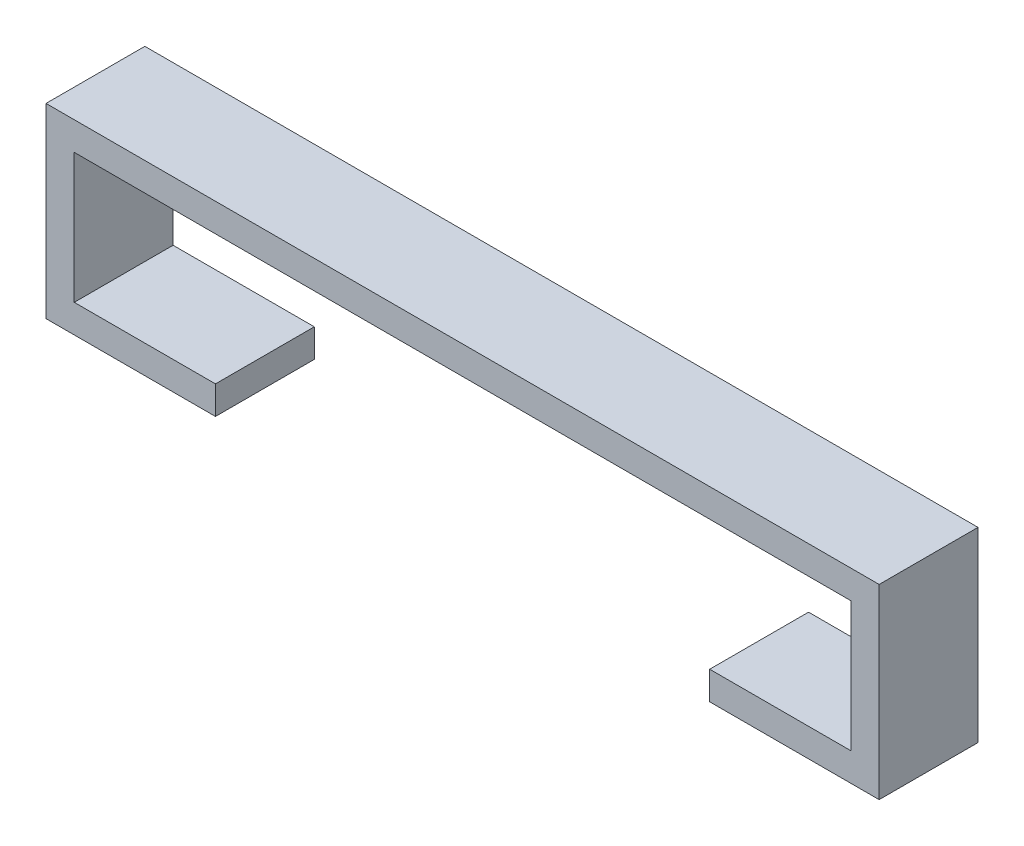
ISO-10303-21;
HEADER;
FILE_DESCRIPTION(('STEP AP214'),'2;1');
FILE_NAME('part.step','',(''),(''),'','','');
FILE_SCHEMA(('AUTOMOTIVE_DESIGN { 1 0 10303 214 1 1 1 1 }'));
ENDSEC;
DATA;
#1=APPLICATION_CONTEXT('core data for automotive mechanical design processes');
#2=APPLICATION_PROTOCOL_DEFINITION('international standard','automotive_design',2000,#1);
#3=PRODUCT_CONTEXT('',#1,'mechanical');
#4=PRODUCT('Part','Part','',(#3));
#5=PRODUCT_RELATED_PRODUCT_CATEGORY('part','',(#4));
#6=PRODUCT_DEFINITION_FORMATION('','',#4);
#7=PRODUCT_DEFINITION_CONTEXT('part definition',#1,'design');
#8=PRODUCT_DEFINITION('design','',#6,#7);
#9=PRODUCT_DEFINITION_SHAPE('','',#8);
#10=(LENGTH_UNIT() NAMED_UNIT(*) SI_UNIT(.MILLI.,.METRE.));
#11=(NAMED_UNIT(*) PLANE_ANGLE_UNIT() SI_UNIT($,.RADIAN.));
#12=(NAMED_UNIT(*) SI_UNIT($,.STERADIAN.) SOLID_ANGLE_UNIT());
#13=UNCERTAINTY_MEASURE_WITH_UNIT(LENGTH_MEASURE(1.E-05),#10,'distance_accuracy_value','');
#14=(GEOMETRIC_REPRESENTATION_CONTEXT(3) GLOBAL_UNCERTAINTY_ASSIGNED_CONTEXT((#13)) GLOBAL_UNIT_ASSIGNED_CONTEXT((#10,
#11,#12)) REPRESENTATION_CONTEXT('',''));
#15=CARTESIAN_POINT('',(0.,0.,0.));
#16=DIRECTION('',(0.,0.,1.));
#17=DIRECTION('',(1.,0.,0.));
#18=AXIS2_PLACEMENT_3D('',#15,#16,#17);
#19=CARTESIAN_POINT('',(29.5,13.2,7.));
#20=DIRECTION('',(-1.,0.,0.));
#21=DIRECTION('',(0.,0.,1.));
#22=AXIS2_PLACEMENT_3D('',#19,#20,#21);
#23=PLANE('',#22);
#24=DIRECTION('',(0.,1.,0.));
#25=VECTOR('',#24,1.);
#26=CARTESIAN_POINT('',(29.5,13.2,0.));
#27=LINE('',#26,#25);
#28=CARTESIAN_POINT('',(29.5,0.,0.));
#29=VERTEX_POINT('',#28);
#30=CARTESIAN_POINT('',(29.5,13.2,0.));
#31=VERTEX_POINT('',#30);
#32=EDGE_CURVE('E168',#29,#31,#27,.T.);
#33=ORIENTED_EDGE('',*,*,#32,.T.);
#34=DIRECTION('',(0.,0.,-1.));
#35=VECTOR('',#34,1.);
#36=CARTESIAN_POINT('',(29.5,13.2,7.));
#37=LINE('',#36,#35);
#38=CARTESIAN_POINT('',(29.5,13.2,7.));
#39=VERTEX_POINT('',#38);
#40=EDGE_CURVE('E11',#39,#31,#37,.T.);
#41=ORIENTED_EDGE('',*,*,#40,.F.);
#42=DIRECTION('',(0.,1.,0.));
#43=VECTOR('',#42,1.);
#44=CARTESIAN_POINT('',(29.5,13.2,7.));
#45=LINE('',#44,#43);
#46=CARTESIAN_POINT('',(29.5,0.,7.));
#47=VERTEX_POINT('',#46);
#48=EDGE_CURVE('E202',#47,#39,#45,.T.);
#49=ORIENTED_EDGE('',*,*,#48,.F.);
#50=DIRECTION('',(0.,0.,-1.));
#51=VECTOR('',#50,1.);
#52=CARTESIAN_POINT('',(29.5,0.,7.));
#53=LINE('',#52,#51);
#54=EDGE_CURVE('E164',#47,#29,#53,.T.);
#55=ORIENTED_EDGE('',*,*,#54,.T.);
#56=EDGE_LOOP('',(#33,#41,#49,#55));
#57=FACE_BOUND('',#56,.T.);
#58=ADVANCED_FACE('F43',(#57),#23,.F.);
#59=CARTESIAN_POINT('',(-29.5,13.2,7.));
#60=DIRECTION('',(0.,-1.,0.));
#61=DIRECTION('',(0.,0.,-1.));
#62=AXIS2_PLACEMENT_3D('',#59,#60,#61);
#63=PLANE('',#62);
#64=DIRECTION('',(-1.,0.,0.));
#65=VECTOR('',#64,1.);
#66=CARTESIAN_POINT('',(-29.5,13.2,0.));
#67=LINE('',#66,#65);
#68=CARTESIAN_POINT('',(-29.5,13.2,0.));
#69=VERTEX_POINT('',#68);
#70=EDGE_CURVE('E172',#31,#69,#67,.T.);
#71=ORIENTED_EDGE('',*,*,#70,.T.);
#72=DIRECTION('',(0.,0.,-1.));
#73=VECTOR('',#72,1.);
#74=CARTESIAN_POINT('',(-29.5,13.2,7.));
#75=LINE('',#74,#73);
#76=CARTESIAN_POINT('',(-29.5,13.2,7.));
#77=VERTEX_POINT('',#76);
#78=EDGE_CURVE('E52',#77,#69,#75,.T.);
#79=ORIENTED_EDGE('',*,*,#78,.F.);
#80=DIRECTION('',(-1.,0.,0.));
#81=VECTOR('',#80,1.);
#82=CARTESIAN_POINT('',(-29.5,13.2,7.));
#83=LINE('',#82,#81);
#84=EDGE_CURVE('E115',#39,#77,#83,.T.);
#85=ORIENTED_EDGE('',*,*,#84,.F.);
#86=ORIENTED_EDGE('',*,*,#40,.T.);
#87=EDGE_LOOP('',(#71,#79,#85,#86));
#88=FACE_BOUND('',#87,.T.);
#89=ADVANCED_FACE('F296',(#88),#63,.F.);
#90=CARTESIAN_POINT('',(-29.5,13.2,7.));
#91=DIRECTION('',(1.,0.,0.));
#92=DIRECTION('',(0.,0.,-1.));
#93=AXIS2_PLACEMENT_3D('',#90,#91,#92);
#94=PLANE('',#93);
#95=DIRECTION('',(0.,-1.,0.));
#96=VECTOR('',#95,1.);
#97=CARTESIAN_POINT('',(-29.5,13.2,0.));
#98=LINE('',#97,#96);
#99=CARTESIAN_POINT('',(-29.5,0.,0.));
#100=VERTEX_POINT('',#99);
#101=EDGE_CURVE('E175',#69,#100,#98,.T.);
#102=ORIENTED_EDGE('',*,*,#101,.T.);
#103=DIRECTION('',(0.,0.,-1.));
#104=VECTOR('',#103,1.);
#105=CARTESIAN_POINT('',(-29.5,0.,7.));
#106=LINE('',#105,#104);
#107=CARTESIAN_POINT('',(-29.5,0.,7.));
#108=VERTEX_POINT('',#107);
#109=EDGE_CURVE('E229',#108,#100,#106,.T.);
#110=ORIENTED_EDGE('',*,*,#109,.F.);
#111=DIRECTION('',(0.,-1.,0.));
#112=VECTOR('',#111,1.);
#113=CARTESIAN_POINT('',(-29.5,13.2,7.));
#114=LINE('',#113,#112);
#115=EDGE_CURVE('E239',#77,#108,#114,.T.);
#116=ORIENTED_EDGE('',*,*,#115,.F.);
#117=ORIENTED_EDGE('',*,*,#78,.T.);
#118=EDGE_LOOP('',(#102,#110,#116,#117));
#119=FACE_BOUND('',#118,.T.);
#120=ADVANCED_FACE('F237',(#119),#94,.F.);
#121=CARTESIAN_POINT('',(-29.5,0.,7.));
#122=DIRECTION('',(0.,1.,0.));
#123=DIRECTION('',(-1.,0.,0.));
#124=AXIS2_PLACEMENT_3D('',#121,#122,#123);
#125=PLANE('',#124);
#126=DIRECTION('',(1.,0.,0.));
#127=VECTOR('',#126,1.);
#128=CARTESIAN_POINT('',(-29.5,0.,0.));
#129=LINE('',#128,#127);
#130=CARTESIAN_POINT('',(-17.5,0.,0.));
#131=VERTEX_POINT('',#130);
#132=EDGE_CURVE('E178',#100,#131,#129,.T.);
#133=ORIENTED_EDGE('',*,*,#132,.T.);
#134=DIRECTION('',(0.,0.,-1.));
#135=VECTOR('',#134,1.);
#136=CARTESIAN_POINT('',(-17.5,0.,7.));
#137=LINE('',#136,#135);
#138=CARTESIAN_POINT('',(-17.5,0.,7.));
#139=VERTEX_POINT('',#138);
#140=EDGE_CURVE('E225',#139,#131,#137,.T.);
#141=ORIENTED_EDGE('',*,*,#140,.F.);
#142=DIRECTION('',(1.,0.,0.));
#143=VECTOR('',#142,1.);
#144=CARTESIAN_POINT('',(-29.5,0.,7.));
#145=LINE('',#144,#143);
#146=EDGE_CURVE('E258',#108,#139,#145,.T.);
#147=ORIENTED_EDGE('',*,*,#146,.F.);
#148=ORIENTED_EDGE('',*,*,#109,.T.);
#149=EDGE_LOOP('',(#133,#141,#147,#148));
#150=FACE_BOUND('',#149,.T.);
#151=ADVANCED_FACE('F248',(#150),#125,.F.);
#152=CARTESIAN_POINT('',(-17.5,0.,7.));
#153=DIRECTION('',(-1.,0.,0.));
#154=DIRECTION('',(0.,0.,1.));
#155=AXIS2_PLACEMENT_3D('',#152,#153,#154);
#156=PLANE('',#155);
#157=DIRECTION('',(0.,1.,0.));
#158=VECTOR('',#157,1.);
#159=CARTESIAN_POINT('',(-17.5,0.,0.));
#160=LINE('',#159,#158);
#161=CARTESIAN_POINT('',(-17.5,2.,0.));
#162=VERTEX_POINT('',#161);
#163=EDGE_CURVE('E181',#131,#162,#160,.T.);
#164=ORIENTED_EDGE('',*,*,#163,.T.);
#165=DIRECTION('',(0.,0.,-1.));
#166=VECTOR('',#165,1.);
#167=CARTESIAN_POINT('',(-17.5,2.,7.));
#168=LINE('',#167,#166);
#169=CARTESIAN_POINT('',(-17.5,2.,7.));
#170=VERTEX_POINT('',#169);
#171=EDGE_CURVE('E221',#170,#162,#168,.T.);
#172=ORIENTED_EDGE('',*,*,#171,.F.);
#173=DIRECTION('',(0.,1.,0.));
#174=VECTOR('',#173,1.);
#175=CARTESIAN_POINT('',(-17.5,0.,7.));
#176=LINE('',#175,#174);
#177=EDGE_CURVE('E254',#139,#170,#176,.T.);
#178=ORIENTED_EDGE('',*,*,#177,.F.);
#179=ORIENTED_EDGE('',*,*,#140,.T.);
#180=EDGE_LOOP('',(#164,#172,#178,#179));
#181=FACE_BOUND('',#180,.T.);
#182=ADVANCED_FACE('F252',(#181),#156,.F.);
#183=CARTESIAN_POINT('',(-17.5,2.,7.));
#184=DIRECTION('',(0.,-1.,0.));
#185=DIRECTION('',(0.,0.,-1.));
#186=AXIS2_PLACEMENT_3D('',#183,#184,#185);
#187=PLANE('',#186);
#188=DIRECTION('',(-1.,0.,0.));
#189=VECTOR('',#188,1.);
#190=CARTESIAN_POINT('',(-17.5,2.,0.));
#191=LINE('',#190,#189);
#192=CARTESIAN_POINT('',(-27.5,2.,0.));
#193=VERTEX_POINT('',#192);
#194=EDGE_CURVE('E184',#162,#193,#191,.T.);
#195=ORIENTED_EDGE('',*,*,#194,.T.);
#196=DIRECTION('',(0.,0.,-1.));
#197=VECTOR('',#196,1.);
#198=CARTESIAN_POINT('',(-27.5,2.,7.));
#199=LINE('',#198,#197);
#200=CARTESIAN_POINT('',(-27.5,2.,7.));
#201=VERTEX_POINT('',#200);
#202=EDGE_CURVE('E217',#201,#193,#199,.T.);
#203=ORIENTED_EDGE('',*,*,#202,.F.);
#204=DIRECTION('',(-1.,0.,0.));
#205=VECTOR('',#204,1.);
#206=CARTESIAN_POINT('',(-17.5,2.,7.));
#207=LINE('',#206,#205);
#208=EDGE_CURVE('E257',#170,#201,#207,.T.);
#209=ORIENTED_EDGE('',*,*,#208,.F.);
#210=ORIENTED_EDGE('',*,*,#171,.T.);
#211=EDGE_LOOP('',(#195,#203,#209,#210));
#212=FACE_BOUND('',#211,.T.);
#213=ADVANCED_FACE('F309',(#212),#187,.F.);
#214=CARTESIAN_POINT('',(-27.5,2.,7.));
#215=DIRECTION('',(-1.,0.,0.));
#216=DIRECTION('',(0.,0.,1.));
#217=AXIS2_PLACEMENT_3D('',#214,#215,#216);
#218=PLANE('',#217);
#219=DIRECTION('',(0.,1.,0.));
#220=VECTOR('',#219,1.);
#221=CARTESIAN_POINT('',(-27.5,2.,0.));
#222=LINE('',#221,#220);
#223=CARTESIAN_POINT('',(-27.5,11.2,0.));
#224=VERTEX_POINT('',#223);
#225=EDGE_CURVE('E187',#193,#224,#222,.T.);
#226=ORIENTED_EDGE('',*,*,#225,.T.);
#227=DIRECTION('',(0.,0.,-1.));
#228=VECTOR('',#227,1.);
#229=CARTESIAN_POINT('',(-27.5,11.2,7.));
#230=LINE('',#229,#228);
#231=CARTESIAN_POINT('',(-27.5,11.2,7.));
#232=VERTEX_POINT('',#231);
#233=EDGE_CURVE('E213',#232,#224,#230,.T.);
#234=ORIENTED_EDGE('',*,*,#233,.F.);
#235=DIRECTION('',(0.,1.,0.));
#236=VECTOR('',#235,1.);
#237=CARTESIAN_POINT('',(-27.5,2.,7.));
#238=LINE('',#237,#236);
#239=EDGE_CURVE('E262',#201,#232,#238,.T.);
#240=ORIENTED_EDGE('',*,*,#239,.F.);
#241=ORIENTED_EDGE('',*,*,#202,.T.);
#242=EDGE_LOOP('',(#226,#234,#240,#241));
#243=FACE_BOUND('',#242,.T.);
#244=ADVANCED_FACE('F312',(#243),#218,.F.);
#245=CARTESIAN_POINT('',(27.5,11.2,7.));
#246=DIRECTION('',(0.,1.,0.));
#247=DIRECTION('',(0.,0.,1.));
#248=AXIS2_PLACEMENT_3D('',#245,#246,#247);
#249=PLANE('',#248);
#250=DIRECTION('',(1.,0.,0.));
#251=VECTOR('',#250,1.);
#252=CARTESIAN_POINT('',(27.5,11.2,0.));
#253=LINE('',#252,#251);
#254=CARTESIAN_POINT('',(27.5,11.2,0.));
#255=VERTEX_POINT('',#254);
#256=EDGE_CURVE('E190',#224,#255,#253,.T.);
#257=ORIENTED_EDGE('',*,*,#256,.T.);
#258=DIRECTION('',(0.,0.,-1.));
#259=VECTOR('',#258,1.);
#260=CARTESIAN_POINT('',(27.5,11.2,7.));
#261=LINE('',#260,#259);
#262=CARTESIAN_POINT('',(27.5,11.2,7.));
#263=VERTEX_POINT('',#262);
#264=EDGE_CURVE('E209',#263,#255,#261,.T.);
#265=ORIENTED_EDGE('',*,*,#264,.F.);
#266=DIRECTION('',(1.,0.,0.));
#267=VECTOR('',#266,1.);
#268=CARTESIAN_POINT('',(27.5,11.2,7.));
#269=LINE('',#268,#267);
#270=EDGE_CURVE('E269',#232,#263,#269,.T.);
#271=ORIENTED_EDGE('',*,*,#270,.F.);
#272=ORIENTED_EDGE('',*,*,#233,.T.);
#273=EDGE_LOOP('',(#257,#265,#271,#272));
#274=FACE_BOUND('',#273,.T.);
#275=ADVANCED_FACE('F277',(#274),#249,.F.);
#276=CARTESIAN_POINT('',(27.5,2.,7.));
#277=DIRECTION('',(1.,0.,0.));
#278=DIRECTION('',(0.,0.,-1.));
#279=AXIS2_PLACEMENT_3D('',#276,#277,#278);
#280=PLANE('',#279);
#281=DIRECTION('',(0.,-1.,0.));
#282=VECTOR('',#281,1.);
#283=CARTESIAN_POINT('',(27.5,2.,0.));
#284=LINE('',#283,#282);
#285=CARTESIAN_POINT('',(27.5,2.,0.));
#286=VERTEX_POINT('',#285);
#287=EDGE_CURVE('E193',#255,#286,#284,.T.);
#288=ORIENTED_EDGE('',*,*,#287,.T.);
#289=DIRECTION('',(0.,0.,-1.));
#290=VECTOR('',#289,1.);
#291=CARTESIAN_POINT('',(27.5,2.,7.));
#292=LINE('',#291,#290);
#293=CARTESIAN_POINT('',(27.5,2.,7.));
#294=VERTEX_POINT('',#293);
#295=EDGE_CURVE('E157',#294,#286,#292,.T.);
#296=ORIENTED_EDGE('',*,*,#295,.F.);
#297=DIRECTION('',(0.,-1.,0.));
#298=VECTOR('',#297,1.);
#299=CARTESIAN_POINT('',(27.5,2.,7.));
#300=LINE('',#299,#298);
#301=EDGE_CURVE('E146',#263,#294,#300,.T.);
#302=ORIENTED_EDGE('',*,*,#301,.F.);
#303=ORIENTED_EDGE('',*,*,#264,.T.);
#304=EDGE_LOOP('',(#288,#296,#302,#303));
#305=FACE_BOUND('',#304,.T.);
#306=ADVANCED_FACE('F281',(#305),#280,.F.);
#307=CARTESIAN_POINT('',(17.5,2.,7.));
#308=DIRECTION('',(0.,-1.,0.));
#309=DIRECTION('',(0.,0.,-1.));
#310=AXIS2_PLACEMENT_3D('',#307,#308,#309);
#311=PLANE('',#310);
#312=DIRECTION('',(-1.,0.,0.));
#313=VECTOR('',#312,1.);
#314=CARTESIAN_POINT('',(17.5,2.,0.));
#315=LINE('',#314,#313);
#316=CARTESIAN_POINT('',(17.5,2.,0.));
#317=VERTEX_POINT('',#316);
#318=EDGE_CURVE('E155',#286,#317,#315,.T.);
#319=ORIENTED_EDGE('',*,*,#318,.T.);
#320=DIRECTION('',(0.,0.,-1.));
#321=VECTOR('',#320,1.);
#322=CARTESIAN_POINT('',(17.5,2.,7.));
#323=LINE('',#322,#321);
#324=CARTESIAN_POINT('',(17.5,2.,7.));
#325=VERTEX_POINT('',#324);
#326=EDGE_CURVE('E152',#325,#317,#323,.T.);
#327=ORIENTED_EDGE('',*,*,#326,.F.);
#328=DIRECTION('',(-1.,0.,0.));
#329=VECTOR('',#328,1.);
#330=CARTESIAN_POINT('',(17.5,2.,7.));
#331=LINE('',#330,#329);
#332=EDGE_CURVE('E140',#294,#325,#331,.T.);
#333=ORIENTED_EDGE('',*,*,#332,.F.);
#334=ORIENTED_EDGE('',*,*,#295,.T.);
#335=EDGE_LOOP('',(#319,#327,#333,#334));
#336=FACE_BOUND('',#335,.T.);
#337=ADVANCED_FACE('F153',(#336),#311,.F.);
#338=CARTESIAN_POINT('',(17.5,0.,7.));
#339=DIRECTION('',(1.,0.,0.));
#340=DIRECTION('',(0.,0.,-1.));
#341=AXIS2_PLACEMENT_3D('',#338,#339,#340);
#342=PLANE('',#341);
#343=DIRECTION('',(0.,-1.,0.));
#344=VECTOR('',#343,1.);
#345=CARTESIAN_POINT('',(17.5,0.,0.));
#346=LINE('',#345,#344);
#347=CARTESIAN_POINT('',(17.5,0.,0.));
#348=VERTEX_POINT('',#347);
#349=EDGE_CURVE('E101',#317,#348,#346,.T.);
#350=ORIENTED_EDGE('',*,*,#349,.T.);
#351=DIRECTION('',(0.,0.,-1.));
#352=VECTOR('',#351,1.);
#353=CARTESIAN_POINT('',(17.5,0.,7.));
#354=LINE('',#353,#352);
#355=CARTESIAN_POINT('',(17.5,0.,7.));
#356=VERTEX_POINT('',#355);
#357=EDGE_CURVE('E158',#356,#348,#354,.T.);
#358=ORIENTED_EDGE('',*,*,#357,.F.);
#359=DIRECTION('',(0.,-1.,0.));
#360=VECTOR('',#359,1.);
#361=CARTESIAN_POINT('',(17.5,0.,7.));
#362=LINE('',#361,#360);
#363=EDGE_CURVE('E144',#325,#356,#362,.T.);
#364=ORIENTED_EDGE('',*,*,#363,.F.);
#365=ORIENTED_EDGE('',*,*,#326,.T.);
#366=EDGE_LOOP('',(#350,#358,#364,#365));
#367=FACE_BOUND('',#366,.T.);
#368=ADVANCED_FACE('F160',(#367),#342,.F.);
#369=CARTESIAN_POINT('',(29.5,0.,7.));
#370=DIRECTION('',(0.,1.,0.));
#371=DIRECTION('',(-1.,0.,0.));
#372=AXIS2_PLACEMENT_3D('',#369,#370,#371);
#373=PLANE('',#372);
#374=DIRECTION('',(1.,0.,0.));
#375=VECTOR('',#374,1.);
#376=CARTESIAN_POINT('',(29.5,0.,0.));
#377=LINE('',#376,#375);
#378=EDGE_CURVE('E107',#348,#29,#377,.T.);
#379=ORIENTED_EDGE('',*,*,#378,.T.);
#380=ORIENTED_EDGE('',*,*,#54,.F.);
#381=DIRECTION('',(1.,0.,0.));
#382=VECTOR('',#381,1.);
#383=CARTESIAN_POINT('',(29.5,0.,7.));
#384=LINE('',#383,#382);
#385=EDGE_CURVE('E60',#356,#47,#384,.T.);
#386=ORIENTED_EDGE('',*,*,#385,.F.);
#387=ORIENTED_EDGE('',*,*,#357,.T.);
#388=EDGE_LOOP('',(#379,#380,#386,#387));
#389=FACE_BOUND('',#388,.T.);
#390=ADVANCED_FACE('F285',(#389),#373,.F.);
#391=CARTESIAN_POINT('',(0.,0.,7.));
#392=DIRECTION('',(0.,0.,-1.));
#393=DIRECTION('',(-1.,0.,0.));
#394=AXIS2_PLACEMENT_3D('',#391,#392,#393);
#395=PLANE('',#394);
#396=ORIENTED_EDGE('',*,*,#48,.T.);
#397=ORIENTED_EDGE('',*,*,#84,.T.);
#398=ORIENTED_EDGE('',*,*,#115,.T.);
#399=ORIENTED_EDGE('',*,*,#146,.T.);
#400=ORIENTED_EDGE('',*,*,#177,.T.);
#401=ORIENTED_EDGE('',*,*,#208,.T.);
#402=ORIENTED_EDGE('',*,*,#239,.T.);
#403=ORIENTED_EDGE('',*,*,#270,.T.);
#404=ORIENTED_EDGE('',*,*,#301,.T.);
#405=ORIENTED_EDGE('',*,*,#332,.T.);
#406=ORIENTED_EDGE('',*,*,#363,.T.);
#407=ORIENTED_EDGE('',*,*,#385,.T.);
#408=EDGE_LOOP('',(#396,#397,#398,#399,#400,#401,#402,#403,#404,#405,#406,#407));
#409=FACE_BOUND('',#408,.T.);
#410=ADVANCED_FACE('F142',(#409),#395,.F.);
#411=CARTESIAN_POINT('',(0.,0.,0.));
#412=DIRECTION('',(0.,0.,-1.));
#413=DIRECTION('',(-1.,0.,0.));
#414=AXIS2_PLACEMENT_3D('',#411,#412,#413);
#415=PLANE('',#414);
#416=ORIENTED_EDGE('',*,*,#32,.F.);
#417=ORIENTED_EDGE('',*,*,#378,.F.);
#418=ORIENTED_EDGE('',*,*,#349,.F.);
#419=ORIENTED_EDGE('',*,*,#318,.F.);
#420=ORIENTED_EDGE('',*,*,#287,.F.);
#421=ORIENTED_EDGE('',*,*,#256,.F.);
#422=ORIENTED_EDGE('',*,*,#225,.F.);
#423=ORIENTED_EDGE('',*,*,#194,.F.);
#424=ORIENTED_EDGE('',*,*,#163,.F.);
#425=ORIENTED_EDGE('',*,*,#132,.F.);
#426=ORIENTED_EDGE('',*,*,#101,.F.);
#427=ORIENTED_EDGE('',*,*,#70,.F.);
#428=EDGE_LOOP('',(#416,#417,#418,#419,#420,#421,#422,#423,#424,#425,#426,#427));
#429=FACE_BOUND('',#428,.T.);
#430=ADVANCED_FACE('F243',(#429),#415,.T.);
#431=CLOSED_SHELL('',(#58,#89,#120,#151,#182,#213,#244,#275,#306,#337,#368,#390,#410,#430));
#432=MANIFOLD_SOLID_BREP('B2',#431);
#433=ADVANCED_BREP_SHAPE_REPRESENTATION('',(#18,#432),#14);
#434=SHAPE_DEFINITION_REPRESENTATION(#9,#433);
ENDSEC;
END-ISO-10303-21;
